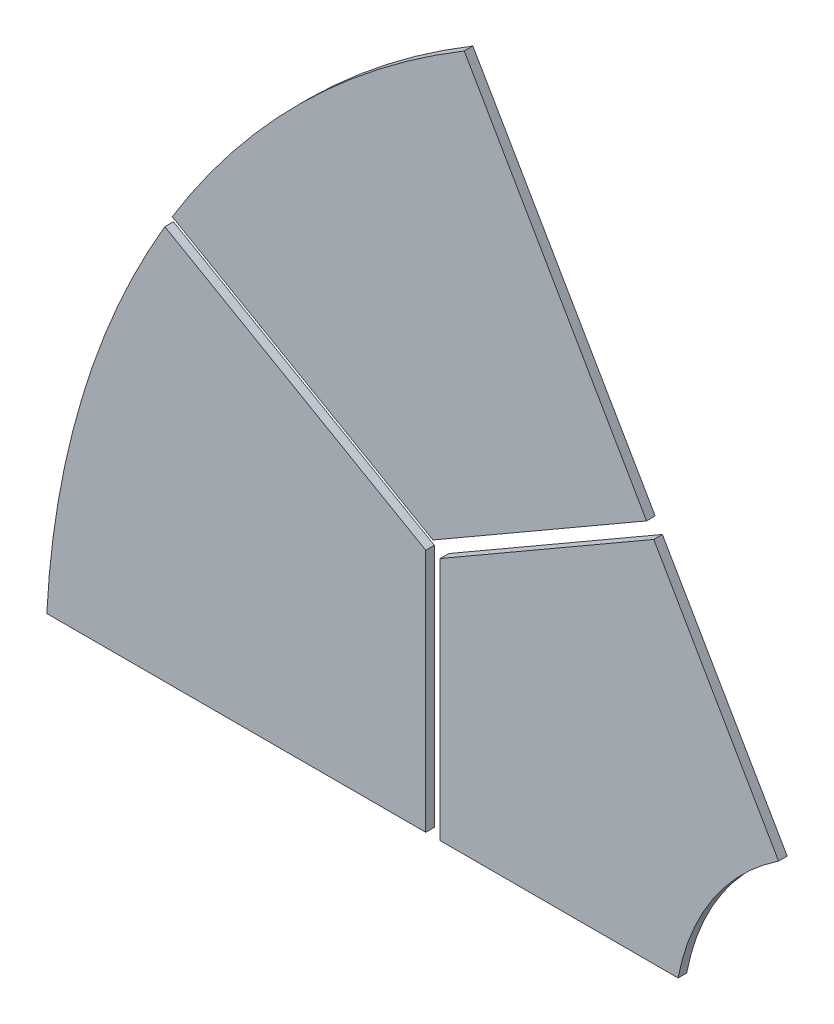
ISO-10303-21;
HEADER;
FILE_DESCRIPTION(('STEP AP214'),'2;1');
FILE_NAME('part.step','',(''),(''),'','','');
FILE_SCHEMA(('AUTOMOTIVE_DESIGN { 1 0 10303 214 1 1 1 1 }'));
ENDSEC;
DATA;
#1=APPLICATION_CONTEXT('core data for automotive mechanical design processes');
#2=APPLICATION_PROTOCOL_DEFINITION('international standard','automotive_design',2000,#1);
#3=PRODUCT_CONTEXT('',#1,'mechanical');
#4=PRODUCT('Part','Part','',(#3));
#5=PRODUCT_RELATED_PRODUCT_CATEGORY('part','',(#4));
#6=PRODUCT_DEFINITION_FORMATION('','',#4);
#7=PRODUCT_DEFINITION_CONTEXT('part definition',#1,'design');
#8=PRODUCT_DEFINITION('design','',#6,#7);
#9=PRODUCT_DEFINITION_SHAPE('','',#8);
#10=(LENGTH_UNIT() NAMED_UNIT(*) SI_UNIT(.MILLI.,.METRE.));
#11=(NAMED_UNIT(*) PLANE_ANGLE_UNIT() SI_UNIT($,.RADIAN.));
#12=(NAMED_UNIT(*) SI_UNIT($,.STERADIAN.) SOLID_ANGLE_UNIT());
#13=UNCERTAINTY_MEASURE_WITH_UNIT(LENGTH_MEASURE(1.E-05),#10,'distance_accuracy_value','');
#14=(GEOMETRIC_REPRESENTATION_CONTEXT(3) GLOBAL_UNCERTAINTY_ASSIGNED_CONTEXT((#13)) GLOBAL_UNIT_ASSIGNED_CONTEXT((#10,
#11,#12)) REPRESENTATION_CONTEXT('',''));
#15=CARTESIAN_POINT('',(0.,0.,0.));
#16=DIRECTION('',(0.,0.,1.));
#17=DIRECTION('',(1.,0.,0.));
#18=AXIS2_PLACEMENT_3D('',#15,#16,#17);
#19=CARTESIAN_POINT('',(0.,0.,6.));
#20=DIRECTION('',(0.,0.,-1.));
#21=DIRECTION('',(-1.,0.,0.));
#22=AXIS2_PLACEMENT_3D('',#19,#20,#21);
#23=CYLINDRICAL_SURFACE('',#22,162.4);
#24=CARTESIAN_POINT('',(0.,0.,0.));
#25=DIRECTION('',(0.,0.,1.));
#26=DIRECTION('',(1.,0.,0.));
#27=AXIS2_PLACEMENT_3D('',#24,#25,#26);
#28=CIRCLE('',#27,162.4);
#29=CARTESIAN_POINT('',(-89.7061669514514,135.37563891217,0.));
#30=VERTEX_POINT('',#29);
#31=CARTESIAN_POINT('',(-159.605012452617,30.,0.));
#32=VERTEX_POINT('',#31);
#33=EDGE_CURVE('E176',#30,#32,#28,.T.);
#34=ORIENTED_EDGE('',*,*,#33,.F.);
#35=DIRECTION('',(0.,0.,-1.));
#36=VECTOR('',#35,1.);
#37=CARTESIAN_POINT('',(-89.7061669514514,135.37563891217,6.));
#38=LINE('',#37,#36);
#39=CARTESIAN_POINT('',(-89.7061669514514,135.37563891217,6.));
#40=VERTEX_POINT('',#39);
#41=EDGE_CURVE('E13',#40,#30,#38,.T.);
#42=ORIENTED_EDGE('',*,*,#41,.F.);
#43=CARTESIAN_POINT('',(0.,0.,6.));
#44=DIRECTION('',(0.,0.,1.));
#45=DIRECTION('',(1.,0.,0.));
#46=AXIS2_PLACEMENT_3D('',#43,#44,#45);
#47=CIRCLE('',#46,162.4);
#48=CARTESIAN_POINT('',(-159.605012452617,30.,6.));
#49=VERTEX_POINT('',#48);
#50=EDGE_CURVE('E187',#40,#49,#47,.T.);
#51=ORIENTED_EDGE('',*,*,#50,.T.);
#52=DIRECTION('',(0.,0.,-1.));
#53=VECTOR('',#52,1.);
#54=CARTESIAN_POINT('',(-159.605012452617,30.,6.));
#55=LINE('',#54,#53);
#56=EDGE_CURVE('E119',#49,#32,#55,.T.);
#57=ORIENTED_EDGE('',*,*,#56,.T.);
#58=EDGE_LOOP('',(#34,#42,#51,#57));
#59=FACE_BOUND('',#58,.T.);
#60=ADVANCED_FACE('F103',(#59),#23,.F.);
#61=CARTESIAN_POINT('',(-8.6602540378442,-4.99999999999989,6.));
#62=DIRECTION('',(-0.866025403784439,-0.5,0.));
#63=DIRECTION('',(0.5,-0.866025403784439,0.));
#64=AXIS2_PLACEMENT_3D('',#61,#62,#63);
#65=PLANE('',#64);
#66=DIRECTION('',(-0.5,0.866025403784439,0.));
#67=VECTOR('',#66,1.);
#68=CARTESIAN_POINT('',(-8.6602540378442,-4.99999999999989,0.));
#69=LINE('',#68,#67);
#70=CARTESIAN_POINT('',(-176.552122678432,285.797246663179,0.));
#71=VERTEX_POINT('',#70);
#72=EDGE_CURVE('E178',#30,#71,#69,.T.);
#73=ORIENTED_EDGE('',*,*,#72,.T.);
#74=DIRECTION('',(0.,0.,-1.));
#75=VECTOR('',#74,1.);
#76=CARTESIAN_POINT('',(-176.552122678432,285.797246663179,6.));
#77=LINE('',#76,#75);
#78=CARTESIAN_POINT('',(-176.552122678432,285.797246663179,6.));
#79=VERTEX_POINT('',#78);
#80=EDGE_CURVE('E111',#79,#71,#77,.T.);
#81=ORIENTED_EDGE('',*,*,#80,.F.);
#82=DIRECTION('',(-0.5,0.866025403784439,0.));
#83=VECTOR('',#82,1.);
#84=CARTESIAN_POINT('',(-8.6602540378442,-4.99999999999989,6.));
#85=LINE('',#84,#83);
#86=EDGE_CURVE('E167',#40,#79,#85,.T.);
#87=ORIENTED_EDGE('',*,*,#86,.F.);
#88=ORIENTED_EDGE('',*,*,#41,.T.);
#89=EDGE_LOOP('',(#73,#81,#87,#88));
#90=FACE_BOUND('',#89,.T.);
#91=ADVANCED_FACE('F191',(#90),#65,.F.);
#92=CARTESIAN_POINT('',(-167.891868640588,290.797246663179,6.));
#93=DIRECTION('',(-0.5,0.866025403784438,0.));
#94=DIRECTION('',(-0.866025403784439,-0.5,0.));
#95=AXIS2_PLACEMENT_3D('',#92,#93,#94);
#96=PLANE('',#95);
#97=DIRECTION('',(0.866025403784439,0.5,0.));
#98=VECTOR('',#97,1.);
#99=CARTESIAN_POINT('',(-167.891868640588,290.797246663179,0.));
#100=LINE('',#99,#98);
#101=CARTESIAN_POINT('',(-325.2,199.975354677105,0.));
#102=VERTEX_POINT('',#101);
#103=EDGE_CURVE('E156',#102,#71,#100,.T.);
#104=ORIENTED_EDGE('',*,*,#103,.F.);
#105=DIRECTION('',(0.,0.,-1.));
#106=VECTOR('',#105,1.);
#107=CARTESIAN_POINT('',(-325.2,199.975354677105,6.));
#108=LINE('',#107,#106);
#109=CARTESIAN_POINT('',(-325.2,199.975354677105,6.));
#110=VERTEX_POINT('',#109);
#111=EDGE_CURVE('E151',#110,#102,#108,.T.);
#112=ORIENTED_EDGE('',*,*,#111,.F.);
#113=DIRECTION('',(0.866025403784439,0.5,0.));
#114=VECTOR('',#113,1.);
#115=CARTESIAN_POINT('',(-167.891868640588,290.797246663179,6.));
#116=LINE('',#115,#114);
#117=EDGE_CURVE('E154',#110,#79,#116,.T.);
#118=ORIENTED_EDGE('',*,*,#117,.T.);
#119=ORIENTED_EDGE('',*,*,#80,.T.);
#120=EDGE_LOOP('',(#104,#112,#118,#119));
#121=FACE_BOUND('',#120,.T.);
#122=ADVANCED_FACE('F153',(#121),#96,.T.);
#123=CARTESIAN_POINT('',(-325.2,0.,6.));
#124=DIRECTION('',(-1.,0.,0.));
#125=DIRECTION('',(0.,0.,1.));
#126=AXIS2_PLACEMENT_3D('',#123,#124,#125);
#127=PLANE('',#126);
#128=DIRECTION('',(0.,1.,0.));
#129=VECTOR('',#128,1.);
#130=CARTESIAN_POINT('',(-325.2,0.,0.));
#131=LINE('',#130,#129);
#132=CARTESIAN_POINT('',(-325.2,30.,0.));
#133=VERTEX_POINT('',#132);
#134=EDGE_CURVE('E182',#133,#102,#131,.T.);
#135=ORIENTED_EDGE('',*,*,#134,.F.);
#136=DIRECTION('',(0.,0.,-1.));
#137=VECTOR('',#136,1.);
#138=CARTESIAN_POINT('',(-325.2,30.,6.));
#139=LINE('',#138,#137);
#140=CARTESIAN_POINT('',(-325.2,30.,6.));
#141=VERTEX_POINT('',#140);
#142=EDGE_CURVE('E135',#141,#133,#139,.T.);
#143=ORIENTED_EDGE('',*,*,#142,.F.);
#144=DIRECTION('',(0.,1.,0.));
#145=VECTOR('',#144,1.);
#146=CARTESIAN_POINT('',(-325.2,0.,6.));
#147=LINE('',#146,#145);
#148=EDGE_CURVE('E166',#141,#110,#147,.T.);
#149=ORIENTED_EDGE('',*,*,#148,.T.);
#150=ORIENTED_EDGE('',*,*,#111,.T.);
#151=EDGE_LOOP('',(#135,#143,#149,#150));
#152=FACE_BOUND('',#151,.T.);
#153=ADVANCED_FACE('F170',(#152),#127,.T.);
#154=CARTESIAN_POINT('',(0.,30.,6.));
#155=DIRECTION('',(0.,-1.,0.));
#156=DIRECTION('',(0.,0.,-1.));
#157=AXIS2_PLACEMENT_3D('',#154,#155,#156);
#158=PLANE('',#157);
#159=DIRECTION('',(-1.,0.,0.));
#160=VECTOR('',#159,1.);
#161=CARTESIAN_POINT('',(0.,30.,0.));
#162=LINE('',#161,#160);
#163=EDGE_CURVE('E184',#32,#133,#162,.T.);
#164=ORIENTED_EDGE('',*,*,#163,.F.);
#165=ORIENTED_EDGE('',*,*,#56,.F.);
#166=DIRECTION('',(-1.,0.,0.));
#167=VECTOR('',#166,1.);
#168=CARTESIAN_POINT('',(0.,30.,6.));
#169=LINE('',#168,#167);
#170=EDGE_CURVE('E171',#49,#141,#169,.T.);
#171=ORIENTED_EDGE('',*,*,#170,.T.);
#172=ORIENTED_EDGE('',*,*,#142,.T.);
#173=EDGE_LOOP('',(#164,#165,#171,#172));
#174=FACE_BOUND('',#173,.T.);
#175=ADVANCED_FACE('F194',(#174),#158,.T.);
#176=CARTESIAN_POINT('',(0.,0.,6.));
#177=DIRECTION('',(0.,0.,1.));
#178=DIRECTION('',(1.,0.,0.));
#179=AXIS2_PLACEMENT_3D('',#176,#177,#178);
#180=PLANE('',#179);
#181=ORIENTED_EDGE('',*,*,#50,.F.);
#182=ORIENTED_EDGE('',*,*,#86,.T.);
#183=ORIENTED_EDGE('',*,*,#117,.F.);
#184=ORIENTED_EDGE('',*,*,#148,.F.);
#185=ORIENTED_EDGE('',*,*,#170,.F.);
#186=EDGE_LOOP('',(#181,#182,#183,#184,#185));
#187=FACE_BOUND('',#186,.T.);
#188=ADVANCED_FACE('F164',(#187),#180,.T.);
#189=CARTESIAN_POINT('',(0.,0.,0.));
#190=DIRECTION('',(0.,0.,1.));
#191=DIRECTION('',(1.,0.,0.));
#192=AXIS2_PLACEMENT_3D('',#189,#190,#191);
#193=PLANE('',#192);
#194=ORIENTED_EDGE('',*,*,#33,.T.);
#195=ORIENTED_EDGE('',*,*,#163,.T.);
#196=ORIENTED_EDGE('',*,*,#134,.T.);
#197=ORIENTED_EDGE('',*,*,#103,.T.);
#198=ORIENTED_EDGE('',*,*,#72,.F.);
#199=EDGE_LOOP('',(#194,#195,#196,#197,#198));
#200=FACE_BOUND('',#199,.T.);
#201=ADVANCED_FACE('F193',(#200),#193,.F.);
#202=CLOSED_SHELL('',(#60,#91,#122,#153,#175,#188,#201));
#203=MANIFOLD_SOLID_BREP('B2',#202);
#204=CARTESIAN_POINT('',(-8.66025403784415,-4.99999999999987,6.));
#205=DIRECTION('',(-0.866025403784438,-0.5,0.));
#206=DIRECTION('',(0.5,-0.866025403784439,0.));
#207=AXIS2_PLACEMENT_3D('',#204,#205,#206);
#208=PLANE('',#207);
#209=DIRECTION('',(-0.5,0.866025403784439,0.));
#210=VECTOR('',#209,1.);
#211=CARTESIAN_POINT('',(-8.66025403784415,-4.99999999999987,0.));
#212=LINE('',#211,#210);
#213=CARTESIAN_POINT('',(-181.552122678432,294.457500701023,0.));
#214=VERTEX_POINT('',#213);
#215=CARTESIAN_POINT('',(-308.418556675144,514.196610158411,0.));
#216=VERTEX_POINT('',#215);
#217=EDGE_CURVE('E352',#214,#216,#212,.T.);
#218=ORIENTED_EDGE('',*,*,#217,.T.);
#219=DIRECTION('',(0.,0.,-1.));
#220=VECTOR('',#219,1.);
#221=CARTESIAN_POINT('',(-308.418556675144,514.196610158411,6.));
#222=LINE('',#221,#220);
#223=CARTESIAN_POINT('',(-308.418556675144,514.196610158411,6.));
#224=VERTEX_POINT('',#223);
#225=EDGE_CURVE('E101',#224,#216,#222,.T.);
#226=ORIENTED_EDGE('',*,*,#225,.F.);
#227=DIRECTION('',(-0.5,0.866025403784439,0.));
#228=VECTOR('',#227,1.);
#229=CARTESIAN_POINT('',(-8.66025403784415,-4.99999999999987,6.));
#230=LINE('',#229,#228);
#231=CARTESIAN_POINT('',(-181.552122678432,294.457500701023,6.));
#232=VERTEX_POINT('',#231);
#233=EDGE_CURVE('E337',#232,#224,#230,.T.);
#234=ORIENTED_EDGE('',*,*,#233,.F.);
#235=DIRECTION('',(0.,0.,-1.));
#236=VECTOR('',#235,1.);
#237=CARTESIAN_POINT('',(-181.552122678432,294.457500701023,6.));
#238=LINE('',#237,#236);
#239=EDGE_CURVE('E348',#232,#214,#238,.T.);
#240=ORIENTED_EDGE('',*,*,#239,.T.);
#241=EDGE_LOOP('',(#218,#226,#234,#240));
#242=FACE_BOUND('',#241,.T.);
#243=ADVANCED_FACE('F290',(#242),#208,.F.);
#244=CARTESIAN_POINT('',(0.,0.,6.));
#245=DIRECTION('',(0.,0.,-1.));
#246=DIRECTION('',(-1.,0.,0.));
#247=AXIS2_PLACEMENT_3D('',#244,#245,#246);
#248=CYLINDRICAL_SURFACE('',#247,599.599999999983);
#249=CARTESIAN_POINT('',(0.,0.,0.));
#250=DIRECTION('',(0.,0.,1.));
#251=DIRECTION('',(1.,0.,0.));
#252=AXIS2_PLACEMENT_3D('',#249,#250,#251);
#253=CIRCLE('',#252,599.599999999983);
#254=CARTESIAN_POINT('',(-511.591783696143,312.72033329251,0.));
#255=VERTEX_POINT('',#254);
#256=EDGE_CURVE('E342',#216,#255,#253,.T.);
#257=ORIENTED_EDGE('',*,*,#256,.T.);
#258=DIRECTION('',(0.,0.,-1.));
#259=VECTOR('',#258,1.);
#260=CARTESIAN_POINT('',(-511.591783696143,312.72033329251,6.));
#261=LINE('',#260,#259);
#262=CARTESIAN_POINT('',(-511.591783696143,312.72033329251,6.));
#263=VERTEX_POINT('',#262);
#264=EDGE_CURVE('E298',#263,#255,#261,.T.);
#265=ORIENTED_EDGE('',*,*,#264,.F.);
#266=CARTESIAN_POINT('',(0.,0.,6.));
#267=DIRECTION('',(0.,0.,1.));
#268=DIRECTION('',(1.,0.,0.));
#269=AXIS2_PLACEMENT_3D('',#266,#267,#268);
#270=CIRCLE('',#269,599.599999999983);
#271=EDGE_CURVE('E332',#224,#263,#270,.T.);
#272=ORIENTED_EDGE('',*,*,#271,.F.);
#273=ORIENTED_EDGE('',*,*,#225,.T.);
#274=EDGE_LOOP('',(#257,#265,#272,#273));
#275=FACE_BOUND('',#274,.T.);
#276=ADVANCED_FACE('F341',(#275),#248,.T.);
#277=CARTESIAN_POINT('',(8.26198220632558,14.3972167266824,6.));
#278=DIRECTION('',(-0.497727654062655,-0.867333374419136,0.));
#279=DIRECTION('',(0.867333374419137,-0.497727654062655,0.));
#280=AXIS2_PLACEMENT_3D('',#277,#278,#279);
#281=PLANE('',#280);
#282=DIRECTION('',(-0.867333374419136,0.497727654062655,0.));
#283=VECTOR('',#282,1.);
#284=CARTESIAN_POINT('',(8.26198220632558,14.3972167266824,0.));
#285=LINE('',#284,#283);
#286=CARTESIAN_POINT('',(-330.207563046549,208.631242187989,0.));
#287=VERTEX_POINT('',#286);
#288=EDGE_CURVE('E356',#287,#255,#285,.T.);
#289=ORIENTED_EDGE('',*,*,#288,.F.);
#290=DIRECTION('',(0.,0.,-1.));
#291=VECTOR('',#290,1.);
#292=CARTESIAN_POINT('',(-330.207563046549,208.631242187989,6.));
#293=LINE('',#292,#291);
#294=CARTESIAN_POINT('',(-330.207563046549,208.631242187989,6.));
#295=VERTEX_POINT('',#294);
#296=EDGE_CURVE('E322',#295,#287,#293,.T.);
#297=ORIENTED_EDGE('',*,*,#296,.F.);
#298=DIRECTION('',(-0.867333374419136,0.497727654062655,0.));
#299=VECTOR('',#298,1.);
#300=CARTESIAN_POINT('',(8.26198220632558,14.3972167266824,6.));
#301=LINE('',#300,#299);
#302=EDGE_CURVE('E335',#295,#263,#301,.T.);
#303=ORIENTED_EDGE('',*,*,#302,.T.);
#304=ORIENTED_EDGE('',*,*,#264,.T.);
#305=EDGE_LOOP('',(#289,#297,#303,#304));
#306=FACE_BOUND('',#305,.T.);
#307=ADVANCED_FACE('F346',(#306),#281,.T.);
#308=CARTESIAN_POINT('',(-172.891868640588,299.457500701023,6.));
#309=DIRECTION('',(-0.5,0.866025403784438,0.));
#310=DIRECTION('',(-0.866025403784439,-0.5,0.));
#311=AXIS2_PLACEMENT_3D('',#308,#309,#310);
#312=PLANE('',#311);
#313=DIRECTION('',(0.866025403784438,0.5,0.));
#314=VECTOR('',#313,1.);
#315=CARTESIAN_POINT('',(-172.891868640588,299.457500701023,0.));
#316=LINE('',#315,#314);
#317=EDGE_CURVE('E325',#287,#214,#316,.T.);
#318=ORIENTED_EDGE('',*,*,#317,.T.);
#319=ORIENTED_EDGE('',*,*,#239,.F.);
#320=DIRECTION('',(0.866025403784438,0.5,0.));
#321=VECTOR('',#320,1.);
#322=CARTESIAN_POINT('',(-172.891868640588,299.457500701023,6.));
#323=LINE('',#322,#321);
#324=EDGE_CURVE('E306',#295,#232,#323,.T.);
#325=ORIENTED_EDGE('',*,*,#324,.F.);
#326=ORIENTED_EDGE('',*,*,#296,.T.);
#327=EDGE_LOOP('',(#318,#319,#325,#326));
#328=FACE_BOUND('',#327,.T.);
#329=ADVANCED_FACE('F369',(#328),#312,.F.);
#330=CARTESIAN_POINT('',(0.,0.,6.));
#331=DIRECTION('',(0.,0.,1.));
#332=DIRECTION('',(1.,0.,0.));
#333=AXIS2_PLACEMENT_3D('',#330,#331,#332);
#334=PLANE('',#333);
#335=ORIENTED_EDGE('',*,*,#233,.T.);
#336=ORIENTED_EDGE('',*,*,#271,.T.);
#337=ORIENTED_EDGE('',*,*,#302,.F.);
#338=ORIENTED_EDGE('',*,*,#324,.T.);
#339=EDGE_LOOP('',(#335,#336,#337,#338));
#340=FACE_BOUND('',#339,.T.);
#341=ADVANCED_FACE('F333',(#340),#334,.T.);
#342=CARTESIAN_POINT('',(0.,0.,0.));
#343=DIRECTION('',(0.,0.,1.));
#344=DIRECTION('',(1.,0.,0.));
#345=AXIS2_PLACEMENT_3D('',#342,#343,#344);
#346=PLANE('',#345);
#347=ORIENTED_EDGE('',*,*,#217,.F.);
#348=ORIENTED_EDGE('',*,*,#317,.F.);
#349=ORIENTED_EDGE('',*,*,#288,.T.);
#350=ORIENTED_EDGE('',*,*,#256,.F.);
#351=EDGE_LOOP('',(#347,#348,#349,#350));
#352=FACE_BOUND('',#351,.T.);
#353=ADVANCED_FACE('F363',(#352),#346,.F.);
#354=CLOSED_SHELL('',(#243,#276,#307,#329,#341,#353));
#355=MANIFOLD_SOLID_BREP('B7',#354);
#356=CARTESIAN_POINT('',(3.28470566569906,5.72388298249105,6.));
#357=DIRECTION('',(-0.497727654062655,-0.867333374419136,0.));
#358=DIRECTION('',(0.867333374419137,-0.497727654062655,0.));
#359=AXIS2_PLACEMENT_3D('',#356,#357,#358);
#360=PLANE('',#359);
#361=DIRECTION('',(-0.867333374419137,0.497727654062655,0.));
#362=VECTOR('',#361,1.);
#363=CARTESIAN_POINT('',(3.28470566569906,5.72388298249105,0.));
#364=LINE('',#363,#362);
#365=CARTESIAN_POINT('',(-335.2,199.966608393473,0.));
#366=VERTEX_POINT('',#365);
#367=CARTESIAN_POINT('',(-516.736885170736,304.143307511484,0.));
#368=VERTEX_POINT('',#367);
#369=EDGE_CURVE('E500',#366,#368,#364,.T.);
#370=ORIENTED_EDGE('',*,*,#369,.T.);
#371=DIRECTION('',(0.,0.,-1.));
#372=VECTOR('',#371,1.);
#373=CARTESIAN_POINT('',(-516.736885170736,304.143307511484,6.));
#374=LINE('',#373,#372);
#375=CARTESIAN_POINT('',(-516.736885170736,304.143307511484,6.));
#376=VERTEX_POINT('',#375);
#377=EDGE_CURVE('E288',#376,#368,#374,.T.);
#378=ORIENTED_EDGE('',*,*,#377,.F.);
#379=DIRECTION('',(-0.867333374419137,0.497727654062655,0.));
#380=VECTOR('',#379,1.);
#381=CARTESIAN_POINT('',(3.28470566569906,5.72388298249105,6.));
#382=LINE('',#381,#380);
#383=CARTESIAN_POINT('',(-335.2,199.966608393473,6.));
#384=VERTEX_POINT('',#383);
#385=EDGE_CURVE('E485',#384,#376,#382,.T.);
#386=ORIENTED_EDGE('',*,*,#385,.F.);
#387=DIRECTION('',(0.,0.,-1.));
#388=VECTOR('',#387,1.);
#389=CARTESIAN_POINT('',(-335.2,199.966608393473,6.));
#390=LINE('',#389,#388);
#391=EDGE_CURVE('E496',#384,#366,#390,.T.);
#392=ORIENTED_EDGE('',*,*,#391,.T.);
#393=EDGE_LOOP('',(#370,#378,#386,#392));
#394=FACE_BOUND('',#393,.T.);
#395=ADVANCED_FACE('F438',(#394),#360,.F.);
#396=CARTESIAN_POINT('',(0.,0.,6.));
#397=DIRECTION('',(0.,0.,-1.));
#398=DIRECTION('',(-1.,0.,0.));
#399=AXIS2_PLACEMENT_3D('',#396,#397,#398);
#400=CYLINDRICAL_SURFACE('',#399,599.599999999983);
#401=CARTESIAN_POINT('',(0.,0.,0.));
#402=DIRECTION('',(0.,0.,1.));
#403=DIRECTION('',(1.,0.,0.));
#404=AXIS2_PLACEMENT_3D('',#401,#402,#403);
#405=CIRCLE('',#404,599.599999999983);
#406=CARTESIAN_POINT('',(-598.84902938886,30.,0.));
#407=VERTEX_POINT('',#406);
#408=EDGE_CURVE('E490',#368,#407,#405,.T.);
#409=ORIENTED_EDGE('',*,*,#408,.T.);
#410=DIRECTION('',(0.,0.,-1.));
#411=VECTOR('',#410,1.);
#412=CARTESIAN_POINT('',(-598.84902938886,30.,6.));
#413=LINE('',#412,#411);
#414=CARTESIAN_POINT('',(-598.84902938886,30.,6.));
#415=VERTEX_POINT('',#414);
#416=EDGE_CURVE('E446',#415,#407,#413,.T.);
#417=ORIENTED_EDGE('',*,*,#416,.F.);
#418=CARTESIAN_POINT('',(0.,0.,6.));
#419=DIRECTION('',(0.,0.,1.));
#420=DIRECTION('',(1.,0.,0.));
#421=AXIS2_PLACEMENT_3D('',#418,#419,#420);
#422=CIRCLE('',#421,599.599999999983);
#423=EDGE_CURVE('E480',#376,#415,#422,.T.);
#424=ORIENTED_EDGE('',*,*,#423,.F.);
#425=ORIENTED_EDGE('',*,*,#377,.T.);
#426=EDGE_LOOP('',(#409,#417,#424,#425));
#427=FACE_BOUND('',#426,.T.);
#428=ADVANCED_FACE('F489',(#427),#400,.T.);
#429=CARTESIAN_POINT('',(0.,30.,6.));
#430=DIRECTION('',(0.,-1.,0.));
#431=DIRECTION('',(0.,0.,-1.));
#432=AXIS2_PLACEMENT_3D('',#429,#430,#431);
#433=PLANE('',#432);
#434=DIRECTION('',(-1.,0.,0.));
#435=VECTOR('',#434,1.);
#436=CARTESIAN_POINT('',(0.,30.,0.));
#437=LINE('',#436,#435);
#438=CARTESIAN_POINT('',(-335.2,30.,0.));
#439=VERTEX_POINT('',#438);
#440=EDGE_CURVE('E504',#439,#407,#437,.T.);
#441=ORIENTED_EDGE('',*,*,#440,.F.);
#442=DIRECTION('',(0.,0.,-1.));
#443=VECTOR('',#442,1.);
#444=CARTESIAN_POINT('',(-335.2,30.,6.));
#445=LINE('',#444,#443);
#446=CARTESIAN_POINT('',(-335.2,30.,6.));
#447=VERTEX_POINT('',#446);
#448=EDGE_CURVE('E470',#447,#439,#445,.T.);
#449=ORIENTED_EDGE('',*,*,#448,.F.);
#450=DIRECTION('',(-1.,0.,0.));
#451=VECTOR('',#450,1.);
#452=CARTESIAN_POINT('',(0.,30.,6.));
#453=LINE('',#452,#451);
#454=EDGE_CURVE('E483',#447,#415,#453,.T.);
#455=ORIENTED_EDGE('',*,*,#454,.T.);
#456=ORIENTED_EDGE('',*,*,#416,.T.);
#457=EDGE_LOOP('',(#441,#449,#455,#456));
#458=FACE_BOUND('',#457,.T.);
#459=ADVANCED_FACE('F494',(#458),#433,.T.);
#460=CARTESIAN_POINT('',(-335.2,1.09476432274518E-13,6.));
#461=DIRECTION('',(-1.,0.,0.));
#462=DIRECTION('',(0.,-1.,0.));
#463=AXIS2_PLACEMENT_3D('',#460,#461,#462);
#464=PLANE('',#463);
#465=DIRECTION('',(0.,1.,0.));
#466=VECTOR('',#465,1.);
#467=CARTESIAN_POINT('',(-335.2,1.09476432274518E-13,0.));
#468=LINE('',#467,#466);
#469=EDGE_CURVE('E473',#439,#366,#468,.T.);
#470=ORIENTED_EDGE('',*,*,#469,.T.);
#471=ORIENTED_EDGE('',*,*,#391,.F.);
#472=DIRECTION('',(0.,1.,0.));
#473=VECTOR('',#472,1.);
#474=CARTESIAN_POINT('',(-335.2,1.09476432274518E-13,6.));
#475=LINE('',#474,#473);
#476=EDGE_CURVE('E454',#447,#384,#475,.T.);
#477=ORIENTED_EDGE('',*,*,#476,.F.);
#478=ORIENTED_EDGE('',*,*,#448,.T.);
#479=EDGE_LOOP('',(#470,#471,#477,#478));
#480=FACE_BOUND('',#479,.T.);
#481=ADVANCED_FACE('F517',(#480),#464,.F.);
#482=CARTESIAN_POINT('',(0.,0.,6.));
#483=DIRECTION('',(0.,0.,1.));
#484=DIRECTION('',(1.,0.,0.));
#485=AXIS2_PLACEMENT_3D('',#482,#483,#484);
#486=PLANE('',#485);
#487=ORIENTED_EDGE('',*,*,#385,.T.);
#488=ORIENTED_EDGE('',*,*,#423,.T.);
#489=ORIENTED_EDGE('',*,*,#454,.F.);
#490=ORIENTED_EDGE('',*,*,#476,.T.);
#491=EDGE_LOOP('',(#487,#488,#489,#490));
#492=FACE_BOUND('',#491,.T.);
#493=ADVANCED_FACE('F481',(#492),#486,.T.);
#494=CARTESIAN_POINT('',(0.,0.,0.));
#495=DIRECTION('',(0.,0.,1.));
#496=DIRECTION('',(1.,0.,0.));
#497=AXIS2_PLACEMENT_3D('',#494,#495,#496);
#498=PLANE('',#497);
#499=ORIENTED_EDGE('',*,*,#369,.F.);
#500=ORIENTED_EDGE('',*,*,#469,.F.);
#501=ORIENTED_EDGE('',*,*,#440,.T.);
#502=ORIENTED_EDGE('',*,*,#408,.F.);
#503=EDGE_LOOP('',(#499,#500,#501,#502));
#504=FACE_BOUND('',#503,.T.);
#505=ADVANCED_FACE('F511',(#504),#498,.F.);
#506=CLOSED_SHELL('',(#395,#428,#459,#481,#493,#505));
#507=MANIFOLD_SOLID_BREP('B95',#506);
#508=ADVANCED_BREP_SHAPE_REPRESENTATION('',(#18,#203,#355,#507),#14);
#509=SHAPE_DEFINITION_REPRESENTATION(#9,#508);
ENDSEC;
END-ISO-10303-21;
